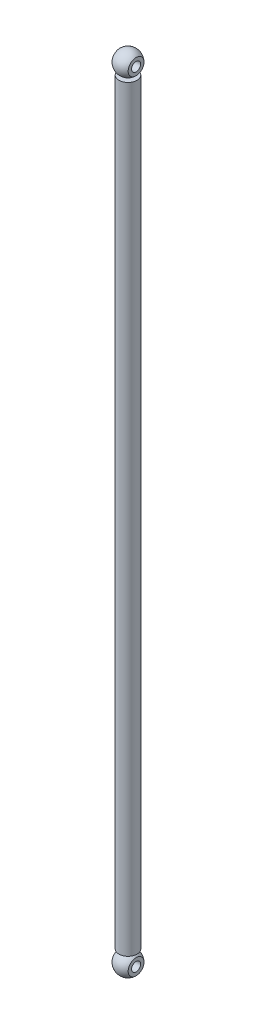
ISO-10303-21;
HEADER;
FILE_DESCRIPTION(('STEP AP214'),'2;1');
FILE_NAME('part.step','',(''),(''),'','','');
FILE_SCHEMA(('AUTOMOTIVE_DESIGN { 1 0 10303 214 1 1 1 1 }'));
ENDSEC;
DATA;
#1=APPLICATION_CONTEXT('core data for automotive mechanical design processes');
#2=APPLICATION_PROTOCOL_DEFINITION('international standard','automotive_design',2000,#1);
#3=PRODUCT_CONTEXT('',#1,'mechanical');
#4=PRODUCT('Part','Part','',(#3));
#5=PRODUCT_RELATED_PRODUCT_CATEGORY('part','',(#4));
#6=PRODUCT_DEFINITION_FORMATION('','',#4);
#7=PRODUCT_DEFINITION_CONTEXT('part definition',#1,'design');
#8=PRODUCT_DEFINITION('design','',#6,#7);
#9=PRODUCT_DEFINITION_SHAPE('','',#8);
#10=(LENGTH_UNIT() NAMED_UNIT(*) SI_UNIT(.MILLI.,.METRE.));
#11=(NAMED_UNIT(*) PLANE_ANGLE_UNIT() SI_UNIT($,.RADIAN.));
#12=(NAMED_UNIT(*) SI_UNIT($,.STERADIAN.) SOLID_ANGLE_UNIT());
#13=UNCERTAINTY_MEASURE_WITH_UNIT(LENGTH_MEASURE(1.E-05),#10,'distance_accuracy_value','');
#14=(GEOMETRIC_REPRESENTATION_CONTEXT(3) GLOBAL_UNCERTAINTY_ASSIGNED_CONTEXT((#13)) GLOBAL_UNIT_ASSIGNED_CONTEXT((#10,
#11,#12)) REPRESENTATION_CONTEXT('',''));
#15=CARTESIAN_POINT('',(0.,0.,0.));
#16=DIRECTION('',(0.,0.,1.));
#17=DIRECTION('',(1.,0.,0.));
#18=AXIS2_PLACEMENT_3D('',#15,#16,#17);
#19=CARTESIAN_POINT('',(0.,339.,0.));
#20=DIRECTION('',(0.,1.,0.));
#21=DIRECTION('',(-1.,0.,0.));
#22=AXIS2_PLACEMENT_3D('',#19,#20,#21);
#23=SPHERICAL_SURFACE('',#22,5.);
#24=CARTESIAN_POINT('',(0.,339.,0.));
#25=DIRECTION('',(1.,0.,0.));
#26=DIRECTION('',(0.,0.,-1.));
#27=AXIS2_PLACEMENT_3D('',#24,#25,#26);
#28=SPHERICAL_SURFACE('',#27,5.);
#29=CARTESIAN_POINT('',(-3.57426123081805,339.,0.));
#30=DIRECTION('',(1.,0.,0.));
#31=DIRECTION('',(0.,0.,-1.));
#32=AXIS2_PLACEMENT_3D('',#29,#30,#31);
#33=CIRCLE('',#32,3.49637764749049);
#34=CARTESIAN_POINT('',(-3.57426123081805,339.,-3.49637764749049));
#35=VERTEX_POINT('',#34);
#36=EDGE_CURVE('E48',#35,#35,#33,.T.);
#37=ORIENTED_EDGE('',*,*,#36,.T.);
#38=EDGE_LOOP('',(#37));
#39=FACE_BOUND('',#38,.T.);
#40=CARTESIAN_POINT('',(3.57426123081805,339.,0.));
#41=DIRECTION('',(-1.,0.,0.));
#42=DIRECTION('',(0.,0.,1.));
#43=AXIS2_PLACEMENT_3D('',#40,#41,#42);
#44=CIRCLE('',#43,3.49637764749049);
#45=CARTESIAN_POINT('',(3.57426123081805,339.,3.49637764749049));
#46=VERTEX_POINT('',#45);
#47=EDGE_CURVE('E11',#46,#46,#44,.T.);
#48=ORIENTED_EDGE('',*,*,#47,.T.);
#49=EDGE_LOOP('',(#48));
#50=FACE_BOUND('',#49,.T.);
#51=ADVANCED_FACE('F41',(#39,#50),#28,.T.);
#52=CARTESIAN_POINT('',(3.57426123081805,334.,-5.));
#53=DIRECTION('',(-1.,0.,0.));
#54=DIRECTION('',(0.,0.,1.));
#55=AXIS2_PLACEMENT_3D('',#52,#53,#54);
#56=PLANE('',#55);
#57=CARTESIAN_POINT('',(3.57426123081805,339.,0.));
#58=DIRECTION('',(1.,0.,0.));
#59=DIRECTION('',(0.,0.,-1.));
#60=AXIS2_PLACEMENT_3D('',#57,#58,#59);
#61=CIRCLE('',#60,2.);
#62=CARTESIAN_POINT('',(3.57426123081805,339.,-2.));
#63=VERTEX_POINT('',#62);
#64=EDGE_CURVE('E54',#63,#63,#61,.T.);
#65=ORIENTED_EDGE('',*,*,#64,.F.);
#66=EDGE_LOOP('',(#65));
#67=FACE_BOUND('',#66,.T.);
#68=ORIENTED_EDGE('',*,*,#47,.F.);
#69=EDGE_LOOP('',(#68));
#70=FACE_BOUND('',#69,.T.);
#71=ADVANCED_FACE('F71',(#67,#70),#56,.F.);
#72=CARTESIAN_POINT('',(-3.57426123081805,334.,-5.));
#73=DIRECTION('',(1.,0.,0.));
#74=DIRECTION('',(0.,0.,-1.));
#75=AXIS2_PLACEMENT_3D('',#72,#73,#74);
#76=PLANE('',#75);
#77=CARTESIAN_POINT('',(-3.57426123081805,339.,0.));
#78=DIRECTION('',(1.,0.,0.));
#79=DIRECTION('',(0.,0.,-1.));
#80=AXIS2_PLACEMENT_3D('',#77,#78,#79);
#81=CIRCLE('',#80,2.);
#82=CARTESIAN_POINT('',(-3.57426123081805,339.,-2.));
#83=VERTEX_POINT('',#82);
#84=EDGE_CURVE('E44',#83,#83,#81,.T.);
#85=ORIENTED_EDGE('',*,*,#84,.T.);
#86=EDGE_LOOP('',(#85));
#87=FACE_BOUND('',#86,.T.);
#88=ORIENTED_EDGE('',*,*,#36,.F.);
#89=EDGE_LOOP('',(#88));
#90=FACE_BOUND('',#89,.T.);
#91=ADVANCED_FACE('F61',(#87,#90),#76,.F.);
#92=CARTESIAN_POINT('',(-6.42573876918195,339.,0.));
#93=DIRECTION('',(1.,0.,0.));
#94=DIRECTION('',(0.,0.,-1.));
#95=AXIS2_PLACEMENT_3D('',#92,#93,#94);
#96=CYLINDRICAL_SURFACE('',#95,2.);
#97=ORIENTED_EDGE('',*,*,#64,.T.);
#98=EDGE_LOOP('',(#97));
#99=FACE_BOUND('',#98,.T.);
#100=ORIENTED_EDGE('',*,*,#84,.F.);
#101=EDGE_LOOP('',(#100));
#102=FACE_BOUND('',#101,.T.);
#103=ADVANCED_FACE('F64',(#99,#102),#96,.F.);
#104=CLOSED_SHELL('',(#51,#71,#91,#103));
#105=MANIFOLD_SOLID_BREP('B2',#104);
#106=CARTESIAN_POINT('',(0.,-5.,0.));
#107=DIRECTION('',(0.,1.,0.));
#108=DIRECTION('',(1.,0.,0.));
#109=AXIS2_PLACEMENT_3D('',#106,#107,#108);
#110=SPHERICAL_SURFACE('',#109,5.);
#111=CARTESIAN_POINT('',(0.,-5.,0.));
#112=DIRECTION('',(1.,0.,0.));
#113=DIRECTION('',(0.,0.,-1.));
#114=AXIS2_PLACEMENT_3D('',#111,#112,#113);
#115=SPHERICAL_SURFACE('',#114,5.);
#116=CARTESIAN_POINT('',(-3.57426123081805,-5.,0.));
#117=DIRECTION('',(1.,0.,0.));
#118=DIRECTION('',(0.,0.,-1.));
#119=AXIS2_PLACEMENT_3D('',#116,#117,#118);
#120=CIRCLE('',#119,3.49637764749043);
#121=CARTESIAN_POINT('',(-3.57426123081805,-5.,-3.49637764749043));
#122=VERTEX_POINT('',#121);
#123=EDGE_CURVE('E40',#122,#122,#120,.T.);
#124=ORIENTED_EDGE('',*,*,#123,.T.);
#125=EDGE_LOOP('',(#124));
#126=FACE_BOUND('',#125,.T.);
#127=CARTESIAN_POINT('',(3.57426123081804,-5.,0.));
#128=DIRECTION('',(-1.,0.,0.));
#129=DIRECTION('',(0.,0.,1.));
#130=AXIS2_PLACEMENT_3D('',#127,#128,#129);
#131=CIRCLE('',#130,3.49637764749053);
#132=CARTESIAN_POINT('',(3.57426123081804,-5.,3.49637764749053));
#133=VERTEX_POINT('',#132);
#134=EDGE_CURVE('E116',#133,#133,#131,.T.);
#135=ORIENTED_EDGE('',*,*,#134,.T.);
#136=EDGE_LOOP('',(#135));
#137=FACE_BOUND('',#136,.T.);
#138=ADVANCED_FACE('F109',(#126,#137),#115,.T.);
#139=CARTESIAN_POINT('',(3.57426123081804,1.11022302462516E-13,-5.));
#140=DIRECTION('',(-1.,0.,0.));
#141=DIRECTION('',(0.,0.,1.));
#142=AXIS2_PLACEMENT_3D('',#139,#140,#141);
#143=PLANE('',#142);
#144=CARTESIAN_POINT('',(3.57426123081805,-5.,0.));
#145=DIRECTION('',(1.,0.,0.));
#146=DIRECTION('',(0.,0.,-1.));
#147=AXIS2_PLACEMENT_3D('',#144,#145,#146);
#148=CIRCLE('',#147,2.);
#149=CARTESIAN_POINT('',(3.57426123081805,-5.,-2.));
#150=VERTEX_POINT('',#149);
#151=EDGE_CURVE('E122',#150,#150,#148,.T.);
#152=ORIENTED_EDGE('',*,*,#151,.F.);
#153=EDGE_LOOP('',(#152));
#154=FACE_BOUND('',#153,.T.);
#155=ORIENTED_EDGE('',*,*,#134,.F.);
#156=EDGE_LOOP('',(#155));
#157=FACE_BOUND('',#156,.T.);
#158=ADVANCED_FACE('F138',(#154,#157),#143,.F.);
#159=CARTESIAN_POINT('',(-3.57426123081805,1.11022302462516E-13,-5.));
#160=DIRECTION('',(1.,0.,0.));
#161=DIRECTION('',(0.,0.,-1.));
#162=AXIS2_PLACEMENT_3D('',#159,#160,#161);
#163=PLANE('',#162);
#164=CARTESIAN_POINT('',(-3.57426123081805,-5.,0.));
#165=DIRECTION('',(1.,0.,0.));
#166=DIRECTION('',(0.,0.,-1.));
#167=AXIS2_PLACEMENT_3D('',#164,#165,#166);
#168=CIRCLE('',#167,2.);
#169=CARTESIAN_POINT('',(-3.57426123081805,-5.,-2.));
#170=VERTEX_POINT('',#169);
#171=EDGE_CURVE('E112',#170,#170,#168,.T.);
#172=ORIENTED_EDGE('',*,*,#171,.T.);
#173=EDGE_LOOP('',(#172));
#174=FACE_BOUND('',#173,.T.);
#175=ORIENTED_EDGE('',*,*,#123,.F.);
#176=EDGE_LOOP('',(#175));
#177=FACE_BOUND('',#176,.T.);
#178=ADVANCED_FACE('F129',(#174,#177),#163,.F.);
#179=CARTESIAN_POINT('',(-6.42573876918195,-5.,0.));
#180=DIRECTION('',(1.,0.,0.));
#181=DIRECTION('',(0.,0.,-1.));
#182=AXIS2_PLACEMENT_3D('',#179,#180,#181);
#183=CYLINDRICAL_SURFACE('',#182,2.);
#184=ORIENTED_EDGE('',*,*,#151,.T.);
#185=EDGE_LOOP('',(#184));
#186=FACE_BOUND('',#185,.T.);
#187=ORIENTED_EDGE('',*,*,#171,.F.);
#188=EDGE_LOOP('',(#187));
#189=FACE_BOUND('',#188,.T.);
#190=ADVANCED_FACE('F132',(#186,#189),#183,.F.);
#191=CLOSED_SHELL('',(#138,#158,#178,#190));
#192=MANIFOLD_SOLID_BREP('B6',#191);
#193=CARTESIAN_POINT('',(0.,0.,0.));
#194=DIRECTION('',(0.,-1.,0.));
#195=DIRECTION('',(0.,0.,-1.));
#196=AXIS2_PLACEMENT_3D('',#193,#194,#195);
#197=PLANE('',#196);
#198=CARTESIAN_POINT('',(0.,0.,0.));
#199=DIRECTION('',(0.,-1.,0.));
#200=DIRECTION('',(0.,0.,-1.));
#201=AXIS2_PLACEMENT_3D('',#198,#199,#200);
#202=CIRCLE('',#201,4.);
#203=CARTESIAN_POINT('',(0.,0.,-4.));
#204=VERTEX_POINT('',#203);
#205=EDGE_CURVE('E108',#204,#204,#202,.T.);
#206=ORIENTED_EDGE('',*,*,#205,.T.);
#207=EDGE_LOOP('',(#206));
#208=FACE_BOUND('',#207,.T.);
#209=ADVANCED_FACE('F170',(#208),#197,.T.);
#210=CARTESIAN_POINT('',(0.,0.,0.));
#211=DIRECTION('',(0.,-1.,0.));
#212=DIRECTION('',(0.,0.,-1.));
#213=AXIS2_PLACEMENT_3D('',#210,#211,#212);
#214=CYLINDRICAL_SURFACE('',#213,4.);
#215=CARTESIAN_POINT('',(0.,334.,0.));
#216=DIRECTION('',(0.,-1.,0.));
#217=DIRECTION('',(0.,0.,-1.));
#218=AXIS2_PLACEMENT_3D('',#215,#216,#217);
#219=CIRCLE('',#218,4.);
#220=CARTESIAN_POINT('',(0.,334.,-4.));
#221=VERTEX_POINT('',#220);
#222=EDGE_CURVE('E176',#221,#221,#219,.T.);
#223=ORIENTED_EDGE('',*,*,#222,.T.);
#224=EDGE_LOOP('',(#223));
#225=FACE_BOUND('',#224,.T.);
#226=ORIENTED_EDGE('',*,*,#205,.F.);
#227=EDGE_LOOP('',(#226));
#228=FACE_BOUND('',#227,.T.);
#229=ADVANCED_FACE('F182',(#225,#228),#214,.T.);
#230=CARTESIAN_POINT('',(4.,334.,0.));
#231=DIRECTION('',(0.,1.,0.));
#232=DIRECTION('',(0.,0.,1.));
#233=AXIS2_PLACEMENT_3D('',#230,#231,#232);
#234=PLANE('',#233);
#235=ORIENTED_EDGE('',*,*,#222,.F.);
#236=EDGE_LOOP('',(#235));
#237=FACE_BOUND('',#236,.T.);
#238=ADVANCED_FACE('F185',(#237),#234,.T.);
#239=CLOSED_SHELL('',(#209,#229,#238));
#240=MANIFOLD_SOLID_BREP('B35',#239);
#241=ADVANCED_BREP_SHAPE_REPRESENTATION('',(#18,#105,#192,#240),#14);
#242=SHAPE_DEFINITION_REPRESENTATION(#9,#241);
ENDSEC;
END-ISO-10303-21;
